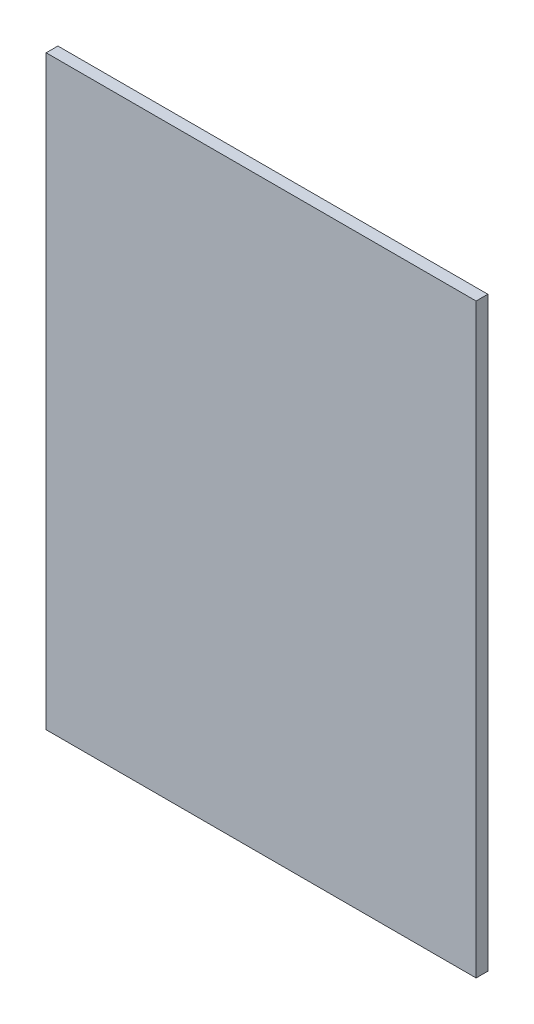
ISO-10303-21;
HEADER;
FILE_DESCRIPTION(('STEP AP214'),'2;1');
FILE_NAME('part.step','',(''),(''),'','','');
FILE_SCHEMA(('AUTOMOTIVE_DESIGN { 1 0 10303 214 1 1 1 1 }'));
ENDSEC;
DATA;
#1=APPLICATION_CONTEXT('core data for automotive mechanical design processes');
#2=APPLICATION_PROTOCOL_DEFINITION('international standard','automotive_design',2000,#1);
#3=PRODUCT_CONTEXT('',#1,'mechanical');
#4=PRODUCT('Part','Part','',(#3));
#5=PRODUCT_RELATED_PRODUCT_CATEGORY('part','',(#4));
#6=PRODUCT_DEFINITION_FORMATION('','',#4);
#7=PRODUCT_DEFINITION_CONTEXT('part definition',#1,'design');
#8=PRODUCT_DEFINITION('design','',#6,#7);
#9=PRODUCT_DEFINITION_SHAPE('','',#8);
#10=(LENGTH_UNIT() NAMED_UNIT(*) SI_UNIT(.MILLI.,.METRE.));
#11=(NAMED_UNIT(*) PLANE_ANGLE_UNIT() SI_UNIT($,.RADIAN.));
#12=(NAMED_UNIT(*) SI_UNIT($,.STERADIAN.) SOLID_ANGLE_UNIT());
#13=UNCERTAINTY_MEASURE_WITH_UNIT(LENGTH_MEASURE(1.E-05),#10,'distance_accuracy_value','');
#14=(GEOMETRIC_REPRESENTATION_CONTEXT(3) GLOBAL_UNCERTAINTY_ASSIGNED_CONTEXT((#13)) GLOBAL_UNIT_ASSIGNED_CONTEXT((#10,
#11,#12)) REPRESENTATION_CONTEXT('',''));
#15=CARTESIAN_POINT('',(0.,0.,0.));
#16=DIRECTION('',(0.,0.,1.));
#17=DIRECTION('',(1.,0.,0.));
#18=AXIS2_PLACEMENT_3D('',#15,#16,#17);
#19=CARTESIAN_POINT('',(-40.6666666666667,114.333333333333,3.));
#20=DIRECTION('',(1.,0.,0.));
#21=DIRECTION('',(0.,1.,0.));
#22=AXIS2_PLACEMENT_3D('',#19,#20,#21);
#23=PLANE('',#22);
#24=DIRECTION('',(0.,-1.,0.));
#25=VECTOR('',#24,1.);
#26=CARTESIAN_POINT('',(-40.6666666666667,114.333333333333,0.));
#27=LINE('',#26,#25);
#28=CARTESIAN_POINT('',(-40.6666666666667,114.333333333333,0.));
#29=VERTEX_POINT('',#28);
#30=CARTESIAN_POINT('',(-40.6666666666667,-35.6666666666667,0.));
#31=VERTEX_POINT('',#30);
#32=EDGE_CURVE('E107',#29,#31,#27,.T.);
#33=ORIENTED_EDGE('',*,*,#32,.T.);
#34=DIRECTION('',(0.,0.,-1.));
#35=VECTOR('',#34,1.);
#36=CARTESIAN_POINT('',(-40.6666666666667,-35.6666666666667,3.));
#37=LINE('',#36,#35);
#38=CARTESIAN_POINT('',(-40.6666666666667,-35.6666666666667,3.));
#39=VERTEX_POINT('',#38);
#40=EDGE_CURVE('E11',#39,#31,#37,.T.);
#41=ORIENTED_EDGE('',*,*,#40,.F.);
#42=DIRECTION('',(0.,-1.,0.));
#43=VECTOR('',#42,1.);
#44=CARTESIAN_POINT('',(-40.6666666666667,114.333333333333,3.));
#45=LINE('',#44,#43);
#46=CARTESIAN_POINT('',(-40.6666666666667,114.333333333333,3.));
#47=VERTEX_POINT('',#46);
#48=EDGE_CURVE('E91',#47,#39,#45,.T.);
#49=ORIENTED_EDGE('',*,*,#48,.F.);
#50=DIRECTION('',(0.,0.,-1.));
#51=VECTOR('',#50,1.);
#52=CARTESIAN_POINT('',(-40.6666666666667,114.333333333333,3.));
#53=LINE('',#52,#51);
#54=EDGE_CURVE('E103',#47,#29,#53,.T.);
#55=ORIENTED_EDGE('',*,*,#54,.T.);
#56=EDGE_LOOP('',(#33,#41,#49,#55));
#57=FACE_BOUND('',#56,.T.);
#58=ADVANCED_FACE('F39',(#57),#23,.F.);
#59=CARTESIAN_POINT('',(-40.6666666666667,-35.6666666666667,3.));
#60=DIRECTION('',(0.,1.,0.));
#61=DIRECTION('',(0.,0.,1.));
#62=AXIS2_PLACEMENT_3D('',#59,#60,#61);
#63=PLANE('',#62);
#64=DIRECTION('',(1.,0.,0.));
#65=VECTOR('',#64,1.);
#66=CARTESIAN_POINT('',(-40.6666666666667,-35.6666666666667,0.));
#67=LINE('',#66,#65);
#68=CARTESIAN_POINT('',(69.3333333333333,-35.6666666666667,0.));
#69=VERTEX_POINT('',#68);
#70=EDGE_CURVE('E96',#31,#69,#67,.T.);
#71=ORIENTED_EDGE('',*,*,#70,.T.);
#72=DIRECTION('',(0.,0.,-1.));
#73=VECTOR('',#72,1.);
#74=CARTESIAN_POINT('',(69.3333333333333,-35.6666666666667,3.));
#75=LINE('',#74,#73);
#76=CARTESIAN_POINT('',(69.3333333333333,-35.6666666666667,3.));
#77=VERTEX_POINT('',#76);
#78=EDGE_CURVE('E48',#77,#69,#75,.T.);
#79=ORIENTED_EDGE('',*,*,#78,.F.);
#80=DIRECTION('',(1.,0.,0.));
#81=VECTOR('',#80,1.);
#82=CARTESIAN_POINT('',(-40.6666666666667,-35.6666666666667,3.));
#83=LINE('',#82,#81);
#84=EDGE_CURVE('E86',#39,#77,#83,.T.);
#85=ORIENTED_EDGE('',*,*,#84,.F.);
#86=ORIENTED_EDGE('',*,*,#40,.T.);
#87=EDGE_LOOP('',(#71,#79,#85,#86));
#88=FACE_BOUND('',#87,.T.);
#89=ADVANCED_FACE('F95',(#88),#63,.F.);
#90=CARTESIAN_POINT('',(69.3333333333333,114.333333333333,3.));
#91=DIRECTION('',(-1.,0.,0.));
#92=DIRECTION('',(0.,0.,1.));
#93=AXIS2_PLACEMENT_3D('',#90,#91,#92);
#94=PLANE('',#93);
#95=DIRECTION('',(0.,1.,0.));
#96=VECTOR('',#95,1.);
#97=CARTESIAN_POINT('',(69.3333333333333,114.333333333333,0.));
#98=LINE('',#97,#96);
#99=CARTESIAN_POINT('',(69.3333333333333,114.333333333333,0.));
#100=VERTEX_POINT('',#99);
#101=EDGE_CURVE('E73',#69,#100,#98,.T.);
#102=ORIENTED_EDGE('',*,*,#101,.T.);
#103=DIRECTION('',(0.,0.,-1.));
#104=VECTOR('',#103,1.);
#105=CARTESIAN_POINT('',(69.3333333333333,114.333333333333,3.));
#106=LINE('',#105,#104);
#107=CARTESIAN_POINT('',(69.3333333333333,114.333333333333,3.));
#108=VERTEX_POINT('',#107);
#109=EDGE_CURVE('E98',#108,#100,#106,.T.);
#110=ORIENTED_EDGE('',*,*,#109,.F.);
#111=DIRECTION('',(0.,1.,0.));
#112=VECTOR('',#111,1.);
#113=CARTESIAN_POINT('',(69.3333333333333,114.333333333333,3.));
#114=LINE('',#113,#112);
#115=EDGE_CURVE('E89',#77,#108,#114,.T.);
#116=ORIENTED_EDGE('',*,*,#115,.F.);
#117=ORIENTED_EDGE('',*,*,#78,.T.);
#118=EDGE_LOOP('',(#102,#110,#116,#117));
#119=FACE_BOUND('',#118,.T.);
#120=ADVANCED_FACE('F99',(#119),#94,.F.);
#121=CARTESIAN_POINT('',(-40.6666666666667,114.333333333333,3.));
#122=DIRECTION('',(0.,-1.,0.));
#123=DIRECTION('',(0.,0.,-1.));
#124=AXIS2_PLACEMENT_3D('',#121,#122,#123);
#125=PLANE('',#124);
#126=DIRECTION('',(-1.,0.,0.));
#127=VECTOR('',#126,1.);
#128=CARTESIAN_POINT('',(-40.6666666666667,114.333333333333,0.));
#129=LINE('',#128,#127);
#130=EDGE_CURVE('E79',#100,#29,#129,.T.);
#131=ORIENTED_EDGE('',*,*,#130,.T.);
#132=ORIENTED_EDGE('',*,*,#54,.F.);
#133=DIRECTION('',(-1.,0.,0.));
#134=VECTOR('',#133,1.);
#135=CARTESIAN_POINT('',(-40.6666666666667,114.333333333333,3.));
#136=LINE('',#135,#134);
#137=EDGE_CURVE('E56',#108,#47,#136,.T.);
#138=ORIENTED_EDGE('',*,*,#137,.F.);
#139=ORIENTED_EDGE('',*,*,#109,.T.);
#140=EDGE_LOOP('',(#131,#132,#138,#139));
#141=FACE_BOUND('',#140,.T.);
#142=ADVANCED_FACE('F120',(#141),#125,.F.);
#143=CARTESIAN_POINT('',(0.,0.,3.));
#144=DIRECTION('',(0.,0.,1.));
#145=DIRECTION('',(1.,0.,0.));
#146=AXIS2_PLACEMENT_3D('',#143,#144,#145);
#147=PLANE('',#146);
#148=ORIENTED_EDGE('',*,*,#48,.T.);
#149=ORIENTED_EDGE('',*,*,#84,.T.);
#150=ORIENTED_EDGE('',*,*,#115,.T.);
#151=ORIENTED_EDGE('',*,*,#137,.T.);
#152=EDGE_LOOP('',(#148,#149,#150,#151));
#153=FACE_BOUND('',#152,.T.);
#154=ADVANCED_FACE('F87',(#153),#147,.T.);
#155=CARTESIAN_POINT('',(0.,0.,0.));
#156=DIRECTION('',(0.,0.,1.));
#157=DIRECTION('',(1.,0.,0.));
#158=AXIS2_PLACEMENT_3D('',#155,#156,#157);
#159=PLANE('',#158);
#160=ORIENTED_EDGE('',*,*,#32,.F.);
#161=ORIENTED_EDGE('',*,*,#130,.F.);
#162=ORIENTED_EDGE('',*,*,#101,.F.);
#163=ORIENTED_EDGE('',*,*,#70,.F.);
#164=EDGE_LOOP('',(#160,#161,#162,#163));
#165=FACE_BOUND('',#164,.T.);
#166=ADVANCED_FACE('F123',(#165),#159,.F.);
#167=CLOSED_SHELL('',(#58,#89,#120,#142,#154,#166));
#168=MANIFOLD_SOLID_BREP('B2',#167);
#169=ADVANCED_BREP_SHAPE_REPRESENTATION('',(#18,#168),#14);
#170=SHAPE_DEFINITION_REPRESENTATION(#9,#169);
ENDSEC;
END-ISO-10303-21;
